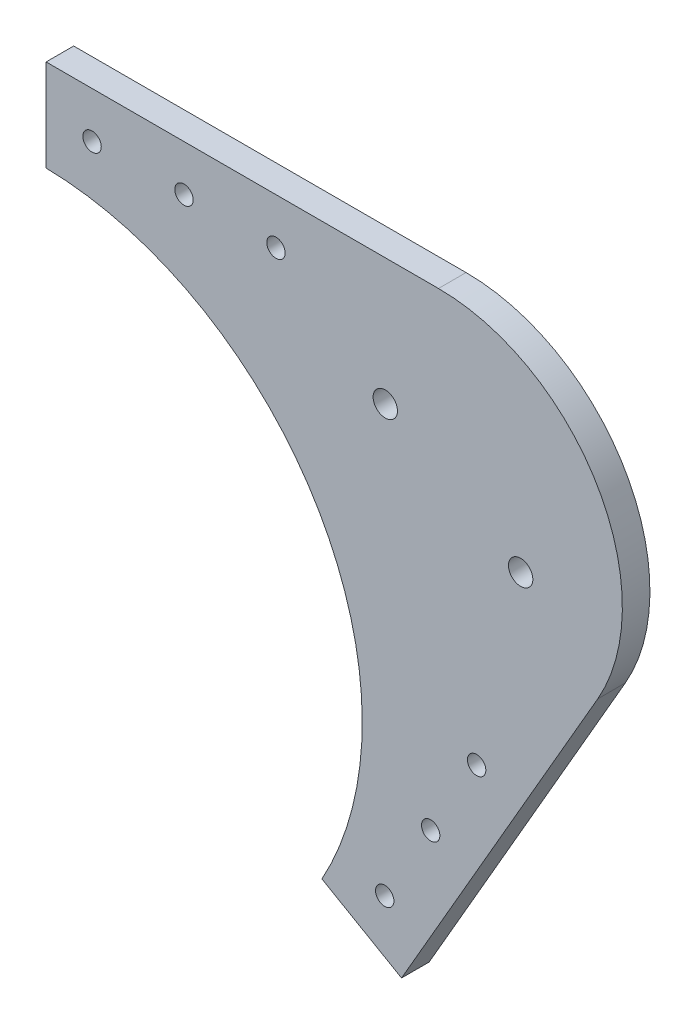
ISO-10303-21;
HEADER;
FILE_DESCRIPTION(('STEP AP214'),'2;1');
FILE_NAME('part.step','',(''),(''),'','','');
FILE_SCHEMA(('AUTOMOTIVE_DESIGN { 1 0 10303 214 1 1 1 1 }'));
ENDSEC;
DATA;
#1=APPLICATION_CONTEXT('core data for automotive mechanical design processes');
#2=APPLICATION_PROTOCOL_DEFINITION('international standard','automotive_design',2000,#1);
#3=PRODUCT_CONTEXT('',#1,'mechanical');
#4=PRODUCT('Part','Part','',(#3));
#5=PRODUCT_RELATED_PRODUCT_CATEGORY('part','',(#4));
#6=PRODUCT_DEFINITION_FORMATION('','',#4);
#7=PRODUCT_DEFINITION_CONTEXT('part definition',#1,'design');
#8=PRODUCT_DEFINITION('design','',#6,#7);
#9=PRODUCT_DEFINITION_SHAPE('','',#8);
#10=(LENGTH_UNIT() NAMED_UNIT(*) SI_UNIT(.MILLI.,.METRE.));
#11=(NAMED_UNIT(*) PLANE_ANGLE_UNIT() SI_UNIT($,.RADIAN.));
#12=(NAMED_UNIT(*) SI_UNIT($,.STERADIAN.) SOLID_ANGLE_UNIT());
#13=UNCERTAINTY_MEASURE_WITH_UNIT(LENGTH_MEASURE(1.E-05),#10,'distance_accuracy_value','');
#14=(GEOMETRIC_REPRESENTATION_CONTEXT(3) GLOBAL_UNCERTAINTY_ASSIGNED_CONTEXT((#13)) GLOBAL_UNIT_ASSIGNED_CONTEXT((#10,
#11,#12)) REPRESENTATION_CONTEXT('',''));
#15=CARTESIAN_POINT('',(0.,0.,0.));
#16=DIRECTION('',(0.,0.,1.));
#17=DIRECTION('',(1.,0.,0.));
#18=AXIS2_PLACEMENT_3D('',#15,#16,#17);
#19=CARTESIAN_POINT('',(0.,0.,6.));
#20=DIRECTION('',(1.,0.,0.));
#21=DIRECTION('',(0.,0.,-1.));
#22=AXIS2_PLACEMENT_3D('',#19,#20,#21);
#23=PLANE('',#22);
#24=DIRECTION('',(0.,-1.,0.));
#25=VECTOR('',#24,1.);
#26=CARTESIAN_POINT('',(0.,0.,0.));
#27=LINE('',#26,#25);
#28=CARTESIAN_POINT('',(0.,20.,0.));
#29=VERTEX_POINT('',#28);
#30=CARTESIAN_POINT('',(0.,0.,0.));
#31=VERTEX_POINT('',#30);
#32=EDGE_CURVE('E120',#29,#31,#27,.T.);
#33=ORIENTED_EDGE('',*,*,#32,.T.);
#34=DIRECTION('',(0.,0.,-1.));
#35=VECTOR('',#34,1.);
#36=CARTESIAN_POINT('',(0.,0.,6.));
#37=LINE('',#36,#35);
#38=CARTESIAN_POINT('',(0.,0.,6.));
#39=VERTEX_POINT('',#38);
#40=EDGE_CURVE('E118',#39,#31,#37,.T.);
#41=ORIENTED_EDGE('',*,*,#40,.F.);
#42=DIRECTION('',(0.,-1.,0.));
#43=VECTOR('',#42,1.);
#44=CARTESIAN_POINT('',(0.,0.,6.));
#45=LINE('',#44,#43);
#46=CARTESIAN_POINT('',(0.,20.,6.));
#47=VERTEX_POINT('',#46);
#48=EDGE_CURVE('E101',#47,#39,#45,.T.);
#49=ORIENTED_EDGE('',*,*,#48,.F.);
#50=DIRECTION('',(0.,0.,-1.));
#51=VECTOR('',#50,1.);
#52=CARTESIAN_POINT('',(0.,20.,6.));
#53=LINE('',#52,#51);
#54=EDGE_CURVE('E260',#47,#29,#53,.T.);
#55=ORIENTED_EDGE('',*,*,#54,.T.);
#56=EDGE_LOOP('',(#33,#41,#49,#55));
#57=FACE_BOUND('',#56,.T.);
#58=ADVANCED_FACE('F46',(#57),#23,.F.);
#59=CARTESIAN_POINT('',(77.3205080756882,-113.923048454132,6.));
#60=DIRECTION('',(0.500000000000004,0.866025403784436,0.));
#61=DIRECTION('',(-0.866025403784436,0.500000000000004,0.));
#62=AXIS2_PLACEMENT_3D('',#59,#60,#61);
#63=PLANE('',#62);
#64=DIRECTION('',(0.866025403784436,-0.500000000000004,0.));
#65=VECTOR('',#64,1.);
#66=CARTESIAN_POINT('',(77.3205080756882,-113.923048454132,0.));
#67=LINE('',#66,#65);
#68=CARTESIAN_POINT('',(59.9999999999995,-103.923048454132,0.));
#69=VERTEX_POINT('',#68);
#70=CARTESIAN_POINT('',(77.3205080756882,-113.923048454132,0.));
#71=VERTEX_POINT('',#70);
#72=EDGE_CURVE('E256',#69,#71,#67,.T.);
#73=ORIENTED_EDGE('',*,*,#72,.T.);
#74=DIRECTION('',(0.,0.,-1.));
#75=VECTOR('',#74,1.);
#76=CARTESIAN_POINT('',(77.3205080756882,-113.923048454132,6.));
#77=LINE('',#76,#75);
#78=CARTESIAN_POINT('',(77.3205080756882,-113.923048454132,6.));
#79=VERTEX_POINT('',#78);
#80=EDGE_CURVE('E263',#79,#71,#77,.T.);
#81=ORIENTED_EDGE('',*,*,#80,.F.);
#82=DIRECTION('',(0.866025403784436,-0.500000000000004,0.));
#83=VECTOR('',#82,1.);
#84=CARTESIAN_POINT('',(77.3205080756882,-113.923048454132,6.));
#85=LINE('',#84,#83);
#86=CARTESIAN_POINT('',(59.9999999999995,-103.923048454132,6.));
#87=VERTEX_POINT('',#86);
#88=EDGE_CURVE('E113',#87,#79,#85,.T.);
#89=ORIENTED_EDGE('',*,*,#88,.F.);
#90=DIRECTION('',(0.,0.,-1.));
#91=VECTOR('',#90,1.);
#92=CARTESIAN_POINT('',(59.9999999999995,-103.923048454132,6.));
#93=LINE('',#92,#91);
#94=EDGE_CURVE('E124',#87,#69,#93,.T.);
#95=ORIENTED_EDGE('',*,*,#94,.T.);
#96=EDGE_LOOP('',(#73,#81,#89,#95));
#97=FACE_BOUND('',#96,.T.);
#98=ADVANCED_FACE('F270',(#97),#63,.F.);
#99=CARTESIAN_POINT('',(154.641016151378,20.,6.));
#100=DIRECTION('',(-0.866025403784436,0.500000000000004,0.));
#101=DIRECTION('',(-0.500000000000004,-0.866025403784436,0.));
#102=AXIS2_PLACEMENT_3D('',#99,#100,#101);
#103=PLANE('',#102);
#104=DIRECTION('',(0.500000000000004,0.866025403784436,0.));
#105=VECTOR('',#104,1.);
#106=CARTESIAN_POINT('',(154.641016151378,20.,0.));
#107=LINE('',#106,#105);
#108=CARTESIAN_POINT('',(120.,-40.0000000000002,0.));
#109=VERTEX_POINT('',#108);
#110=EDGE_CURVE('E253',#71,#109,#107,.T.);
#111=ORIENTED_EDGE('',*,*,#110,.T.);
#112=DIRECTION('',(0.,0.,-1.));
#113=VECTOR('',#112,1.);
#114=CARTESIAN_POINT('',(120.,-40.0000000000002,6.));
#115=LINE('',#114,#113);
#116=CARTESIAN_POINT('',(120.,-40.0000000000002,6.));
#117=VERTEX_POINT('',#116);
#118=EDGE_CURVE('E56',#109,#117,#115,.F.);
#119=ORIENTED_EDGE('',*,*,#118,.T.);
#120=DIRECTION('',(0.500000000000004,0.866025403784436,0.));
#121=VECTOR('',#120,1.);
#122=CARTESIAN_POINT('',(154.641016151378,20.,6.));
#123=LINE('',#122,#121);
#124=EDGE_CURVE('E151',#79,#117,#123,.T.);
#125=ORIENTED_EDGE('',*,*,#124,.F.);
#126=ORIENTED_EDGE('',*,*,#80,.T.);
#127=EDGE_LOOP('',(#111,#119,#125,#126));
#128=FACE_BOUND('',#127,.T.);
#129=ADVANCED_FACE('F299',(#128),#103,.F.);
#130=CARTESIAN_POINT('',(0.,20.,6.));
#131=DIRECTION('',(0.,-1.,0.));
#132=DIRECTION('',(0.,0.,-1.));
#133=AXIS2_PLACEMENT_3D('',#130,#131,#132);
#134=PLANE('',#133);
#135=DIRECTION('',(-1.,0.,0.));
#136=VECTOR('',#135,1.);
#137=CARTESIAN_POINT('',(0.,20.,6.));
#138=LINE('',#137,#136);
#139=CARTESIAN_POINT('',(85.3589838486223,20.,6.));
#140=VERTEX_POINT('',#139);
#141=EDGE_CURVE('E108',#140,#47,#138,.T.);
#142=ORIENTED_EDGE('',*,*,#141,.F.);
#143=DIRECTION('',(0.,0.,-1.));
#144=VECTOR('',#143,1.);
#145=CARTESIAN_POINT('',(85.3589838486223,20.,6.));
#146=LINE('',#145,#144);
#147=CARTESIAN_POINT('',(85.3589838486223,20.,0.));
#148=VERTEX_POINT('',#147);
#149=EDGE_CURVE('E130',#140,#148,#146,.T.);
#150=ORIENTED_EDGE('',*,*,#149,.T.);
#151=DIRECTION('',(-1.,0.,0.));
#152=VECTOR('',#151,1.);
#153=CARTESIAN_POINT('',(0.,20.,0.));
#154=LINE('',#153,#152);
#155=EDGE_CURVE('E114',#148,#29,#154,.T.);
#156=ORIENTED_EDGE('',*,*,#155,.T.);
#157=ORIENTED_EDGE('',*,*,#54,.F.);
#158=EDGE_LOOP('',(#142,#150,#156,#157));
#159=FACE_BOUND('',#158,.T.);
#160=ADVANCED_FACE('F311',(#159),#134,.F.);
#161=CARTESIAN_POINT('',(0.,0.,6.));
#162=DIRECTION('',(0.,0.,-1.));
#163=DIRECTION('',(-1.,0.,0.));
#164=AXIS2_PLACEMENT_3D('',#161,#162,#163);
#165=PLANE('',#164);
#166=CARTESIAN_POINT('',(10.,10.,6.));
#167=DIRECTION('',(0.,0.,1.));
#168=DIRECTION('',(1.,0.,0.));
#169=AXIS2_PLACEMENT_3D('',#166,#167,#168);
#170=CIRCLE('',#169,2.);
#171=CARTESIAN_POINT('',(12.,10.,6.));
#172=VERTEX_POINT('',#171);
#173=EDGE_CURVE('E199',#172,#172,#170,.T.);
#174=ORIENTED_EDGE('',*,*,#173,.F.);
#175=EDGE_LOOP('',(#174));
#176=FACE_BOUND('',#175,.T.);
#177=CARTESIAN_POINT('',(30.,10.,6.));
#178=DIRECTION('',(0.,0.,1.));
#179=DIRECTION('',(1.,0.,0.));
#180=AXIS2_PLACEMENT_3D('',#177,#178,#179);
#181=CIRCLE('',#180,2.);
#182=CARTESIAN_POINT('',(32.,10.,6.));
#183=VERTEX_POINT('',#182);
#184=EDGE_CURVE('E194',#183,#183,#181,.T.);
#185=ORIENTED_EDGE('',*,*,#184,.F.);
#186=EDGE_LOOP('',(#185));
#187=FACE_BOUND('',#186,.T.);
#188=CARTESIAN_POINT('',(50.,10.,6.));
#189=DIRECTION('',(0.,0.,1.));
#190=DIRECTION('',(1.,0.,0.));
#191=AXIS2_PLACEMENT_3D('',#188,#189,#190);
#192=CIRCLE('',#191,2.);
#193=CARTESIAN_POINT('',(52.,10.,6.));
#194=VERTEX_POINT('',#193);
#195=EDGE_CURVE('E189',#194,#194,#192,.T.);
#196=ORIENTED_EDGE('',*,*,#195,.F.);
#197=EDGE_LOOP('',(#196));
#198=FACE_BOUND('',#197,.T.);
#199=CARTESIAN_POINT('',(73.6602540378439,-100.262794416288,6.));
#200=DIRECTION('',(0.,0.,1.));
#201=DIRECTION('',(1.,0.,0.));
#202=AXIS2_PLACEMENT_3D('',#199,#200,#201);
#203=CIRCLE('',#202,2.);
#204=CARTESIAN_POINT('',(75.6602540378439,-100.262794416288,6.));
#205=VERTEX_POINT('',#204);
#206=EDGE_CURVE('E185',#205,#205,#203,.T.);
#207=ORIENTED_EDGE('',*,*,#206,.F.);
#208=EDGE_LOOP('',(#207));
#209=FACE_BOUND('',#208,.T.);
#210=CARTESIAN_POINT('',(83.660254037844,-82.9422863405993,6.));
#211=DIRECTION('',(0.,0.,1.));
#212=DIRECTION('',(1.,0.,0.));
#213=AXIS2_PLACEMENT_3D('',#210,#211,#212);
#214=CIRCLE('',#213,2.);
#215=CARTESIAN_POINT('',(85.660254037844,-82.9422863405993,6.));
#216=VERTEX_POINT('',#215);
#217=EDGE_CURVE('E177',#216,#216,#214,.T.);
#218=ORIENTED_EDGE('',*,*,#217,.F.);
#219=EDGE_LOOP('',(#218));
#220=FACE_BOUND('',#219,.T.);
#221=CARTESIAN_POINT('',(93.660254037844,-65.6217782649105,6.));
#222=DIRECTION('',(0.,0.,1.));
#223=DIRECTION('',(1.,0.,0.));
#224=AXIS2_PLACEMENT_3D('',#221,#222,#223);
#225=CIRCLE('',#224,2.);
#226=CARTESIAN_POINT('',(95.660254037844,-65.6217782649105,6.));
#227=VERTEX_POINT('',#226);
#228=EDGE_CURVE('E172',#227,#227,#225,.T.);
#229=ORIENTED_EDGE('',*,*,#228,.F.);
#230=EDGE_LOOP('',(#229));
#231=FACE_BOUND('',#230,.T.);
#232=CARTESIAN_POINT('',(103.232600297823,-24.5458345764419,6.));
#233=DIRECTION('',(0.,0.,-1.));
#234=DIRECTION('',(-1.,0.,0.));
#235=AXIS2_PLACEMENT_3D('',#232,#233,#234);
#236=CIRCLE('',#235,2.65);
#237=CARTESIAN_POINT('',(100.582600297823,-24.5458345764419,6.));
#238=VERTEX_POINT('',#237);
#239=EDGE_CURVE('E145',#238,#238,#236,.T.);
#240=ORIENTED_EDGE('',*,*,#239,.T.);
#241=EDGE_LOOP('',(#240));
#242=FACE_BOUND('',#241,.T.);
#243=CARTESIAN_POINT('',(73.787736569152,-7.54583457644185,6.));
#244=DIRECTION('',(0.,0.,-1.));
#245=DIRECTION('',(-1.,0.,0.));
#246=AXIS2_PLACEMENT_3D('',#243,#244,#245);
#247=CIRCLE('',#246,2.65);
#248=CARTESIAN_POINT('',(71.137736569152,-7.54583457644185,6.));
#249=VERTEX_POINT('',#248);
#250=EDGE_CURVE('E159',#249,#249,#247,.T.);
#251=ORIENTED_EDGE('',*,*,#250,.T.);
#252=EDGE_LOOP('',(#251));
#253=FACE_BOUND('',#252,.T.);
#254=ORIENTED_EDGE('',*,*,#124,.T.);
#255=CARTESIAN_POINT('',(85.3589838486223,-20.,6.));
#256=DIRECTION('',(0.,0.,-1.));
#257=DIRECTION('',(-1.,0.,0.));
#258=AXIS2_PLACEMENT_3D('',#255,#256,#257);
#259=CIRCLE('',#258,40.);
#260=EDGE_CURVE('E12',#117,#140,#259,.F.);
#261=ORIENTED_EDGE('',*,*,#260,.T.);
#262=ORIENTED_EDGE('',*,*,#141,.T.);
#263=ORIENTED_EDGE('',*,*,#48,.T.);
#264=CARTESIAN_POINT('',(-1.22498999199263,-69.9892806043863,6.));
#265=DIRECTION('',(0.,0.,-1.));
#266=DIRECTION('',(-1.,0.,0.));
#267=AXIS2_PLACEMENT_3D('',#264,#265,#266);
#268=CIRCLE('',#267,70.);
#269=EDGE_CURVE('E105',#39,#87,#268,.T.);
#270=ORIENTED_EDGE('',*,*,#269,.T.);
#271=ORIENTED_EDGE('',*,*,#88,.T.);
#272=EDGE_LOOP('',(#254,#261,#262,#263,#270,#271));
#273=FACE_BOUND('',#272,.T.);
#274=ADVANCED_FACE('F103',(#176,#187,#198,#209,#220,#231,#242,#253,#273),#165,.F.);
#275=CARTESIAN_POINT('',(0.,0.,0.));
#276=DIRECTION('',(0.,0.,-1.));
#277=DIRECTION('',(-1.,0.,0.));
#278=AXIS2_PLACEMENT_3D('',#275,#276,#277);
#279=PLANE('',#278);
#280=CARTESIAN_POINT('',(10.,10.,0.));
#281=DIRECTION('',(0.,0.,-1.));
#282=DIRECTION('',(-1.,0.,0.));
#283=AXIS2_PLACEMENT_3D('',#280,#281,#282);
#284=CIRCLE('',#283,2.);
#285=CARTESIAN_POINT('',(8.,10.,0.));
#286=VERTEX_POINT('',#285);
#287=EDGE_CURVE('E50',#286,#286,#284,.T.);
#288=ORIENTED_EDGE('',*,*,#287,.F.);
#289=EDGE_LOOP('',(#288));
#290=FACE_BOUND('',#289,.T.);
#291=CARTESIAN_POINT('',(30.,10.,0.));
#292=DIRECTION('',(0.,0.,-1.));
#293=DIRECTION('',(-1.,0.,0.));
#294=AXIS2_PLACEMENT_3D('',#291,#292,#293);
#295=CIRCLE('',#294,2.);
#296=CARTESIAN_POINT('',(28.,10.,0.));
#297=VERTEX_POINT('',#296);
#298=EDGE_CURVE('E225',#297,#297,#295,.T.);
#299=ORIENTED_EDGE('',*,*,#298,.F.);
#300=EDGE_LOOP('',(#299));
#301=FACE_BOUND('',#300,.T.);
#302=CARTESIAN_POINT('',(50.,10.,0.));
#303=DIRECTION('',(0.,0.,-1.));
#304=DIRECTION('',(-1.,0.,0.));
#305=AXIS2_PLACEMENT_3D('',#302,#303,#304);
#306=CIRCLE('',#305,2.);
#307=CARTESIAN_POINT('',(48.,10.,0.));
#308=VERTEX_POINT('',#307);
#309=EDGE_CURVE('E222',#308,#308,#306,.T.);
#310=ORIENTED_EDGE('',*,*,#309,.F.);
#311=EDGE_LOOP('',(#310));
#312=FACE_BOUND('',#311,.T.);
#313=CARTESIAN_POINT('',(73.6602540378439,-100.262794416288,0.));
#314=DIRECTION('',(0.,0.,-1.));
#315=DIRECTION('',(-1.,0.,0.));
#316=AXIS2_PLACEMENT_3D('',#313,#314,#315);
#317=CIRCLE('',#316,2.);
#318=CARTESIAN_POINT('',(71.6602540378439,-100.262794416288,0.));
#319=VERTEX_POINT('',#318);
#320=EDGE_CURVE('E215',#319,#319,#317,.T.);
#321=ORIENTED_EDGE('',*,*,#320,.F.);
#322=EDGE_LOOP('',(#321));
#323=FACE_BOUND('',#322,.T.);
#324=CARTESIAN_POINT('',(83.660254037844,-82.9422863405993,0.));
#325=DIRECTION('',(0.,0.,-1.));
#326=DIRECTION('',(-1.,0.,0.));
#327=AXIS2_PLACEMENT_3D('',#324,#325,#326);
#328=CIRCLE('',#327,2.);
#329=CARTESIAN_POINT('',(81.660254037844,-82.9422863405993,0.));
#330=VERTEX_POINT('',#329);
#331=EDGE_CURVE('E209',#330,#330,#328,.T.);
#332=ORIENTED_EDGE('',*,*,#331,.F.);
#333=EDGE_LOOP('',(#332));
#334=FACE_BOUND('',#333,.T.);
#335=CARTESIAN_POINT('',(93.660254037844,-65.6217782649105,0.));
#336=DIRECTION('',(0.,0.,-1.));
#337=DIRECTION('',(-1.,0.,0.));
#338=AXIS2_PLACEMENT_3D('',#335,#336,#337);
#339=CIRCLE('',#338,2.);
#340=CARTESIAN_POINT('',(91.660254037844,-65.6217782649105,0.));
#341=VERTEX_POINT('',#340);
#342=EDGE_CURVE('E204',#341,#341,#339,.T.);
#343=ORIENTED_EDGE('',*,*,#342,.F.);
#344=EDGE_LOOP('',(#343));
#345=FACE_BOUND('',#344,.T.);
#346=CARTESIAN_POINT('',(103.232600297823,-24.5458345764419,0.));
#347=DIRECTION('',(0.,0.,1.));
#348=DIRECTION('',(1.,0.,0.));
#349=AXIS2_PLACEMENT_3D('',#346,#347,#348);
#350=CIRCLE('',#349,2.65);
#351=CARTESIAN_POINT('',(105.882600297823,-24.5458345764419,0.));
#352=VERTEX_POINT('',#351);
#353=EDGE_CURVE('E164',#352,#352,#350,.T.);
#354=ORIENTED_EDGE('',*,*,#353,.T.);
#355=EDGE_LOOP('',(#354));
#356=FACE_BOUND('',#355,.T.);
#357=CARTESIAN_POINT('',(73.787736569152,-7.54583457644185,0.));
#358=DIRECTION('',(0.,0.,1.));
#359=DIRECTION('',(1.,0.,0.));
#360=AXIS2_PLACEMENT_3D('',#357,#358,#359);
#361=CIRCLE('',#360,2.65);
#362=CARTESIAN_POINT('',(76.437736569152,-7.54583457644185,0.));
#363=VERTEX_POINT('',#362);
#364=EDGE_CURVE('E165',#363,#363,#361,.T.);
#365=ORIENTED_EDGE('',*,*,#364,.T.);
#366=EDGE_LOOP('',(#365));
#367=FACE_BOUND('',#366,.T.);
#368=ORIENTED_EDGE('',*,*,#155,.F.);
#369=CARTESIAN_POINT('',(85.3589838486223,-20.,0.));
#370=DIRECTION('',(0.,0.,-1.));
#371=DIRECTION('',(-1.,0.,0.));
#372=AXIS2_PLACEMENT_3D('',#369,#370,#371);
#373=CIRCLE('',#372,40.);
#374=EDGE_CURVE('E71',#148,#109,#373,.T.);
#375=ORIENTED_EDGE('',*,*,#374,.T.);
#376=ORIENTED_EDGE('',*,*,#110,.F.);
#377=ORIENTED_EDGE('',*,*,#72,.F.);
#378=CARTESIAN_POINT('',(-1.22498999199263,-69.9892806043863,0.));
#379=DIRECTION('',(0.,0.,-1.));
#380=DIRECTION('',(-1.,0.,0.));
#381=AXIS2_PLACEMENT_3D('',#378,#379,#380);
#382=CIRCLE('',#381,70.);
#383=EDGE_CURVE('E123',#69,#31,#382,.F.);
#384=ORIENTED_EDGE('',*,*,#383,.T.);
#385=ORIENTED_EDGE('',*,*,#32,.F.);
#386=EDGE_LOOP('',(#368,#375,#376,#377,#384,#385));
#387=FACE_BOUND('',#386,.T.);
#388=ADVANCED_FACE('F236',(#290,#301,#312,#323,#334,#345,#356,#367,#387),#279,.T.);
#389=CARTESIAN_POINT('',(-1.22498999199263,-69.9892806043863,6.));
#390=DIRECTION('',(0.,0.,1.));
#391=DIRECTION('',(1.,0.,0.));
#392=AXIS2_PLACEMENT_3D('',#389,#390,#391);
#393=CYLINDRICAL_SURFACE('',#392,70.);
#394=ORIENTED_EDGE('',*,*,#269,.F.);
#395=ORIENTED_EDGE('',*,*,#40,.T.);
#396=ORIENTED_EDGE('',*,*,#383,.F.);
#397=ORIENTED_EDGE('',*,*,#94,.F.);
#398=EDGE_LOOP('',(#394,#395,#396,#397));
#399=FACE_BOUND('',#398,.T.);
#400=ADVANCED_FACE('F127',(#399),#393,.F.);
#401=CARTESIAN_POINT('',(85.3589838486223,-20.,6.));
#402=DIRECTION('',(0.,0.,-1.));
#403=DIRECTION('',(-1.,0.,0.));
#404=AXIS2_PLACEMENT_3D('',#401,#402,#403);
#405=CYLINDRICAL_SURFACE('',#404,40.);
#406=ORIENTED_EDGE('',*,*,#260,.F.);
#407=ORIENTED_EDGE('',*,*,#118,.F.);
#408=ORIENTED_EDGE('',*,*,#374,.F.);
#409=ORIENTED_EDGE('',*,*,#149,.F.);
#410=EDGE_LOOP('',(#406,#407,#408,#409));
#411=FACE_BOUND('',#410,.T.);
#412=ADVANCED_FACE('F48',(#411),#405,.T.);
#413=CARTESIAN_POINT('',(73.787736569152,-7.54583457644185,0.));
#414=DIRECTION('',(0.,0.,1.));
#415=DIRECTION('',(1.,0.,0.));
#416=AXIS2_PLACEMENT_3D('',#413,#414,#415);
#417=CYLINDRICAL_SURFACE('',#416,2.65);
#418=ORIENTED_EDGE('',*,*,#364,.F.);
#419=EDGE_LOOP('',(#418));
#420=FACE_BOUND('',#419,.T.);
#421=ORIENTED_EDGE('',*,*,#250,.F.);
#422=EDGE_LOOP('',(#421));
#423=FACE_BOUND('',#422,.T.);
#424=ADVANCED_FACE('F283',(#420,#423),#417,.F.);
#425=CARTESIAN_POINT('',(103.232600297823,-24.5458345764419,0.));
#426=DIRECTION('',(0.,0.,1.));
#427=DIRECTION('',(1.,0.,0.));
#428=AXIS2_PLACEMENT_3D('',#425,#426,#427);
#429=CYLINDRICAL_SURFACE('',#428,2.65);
#430=ORIENTED_EDGE('',*,*,#353,.F.);
#431=EDGE_LOOP('',(#430));
#432=FACE_BOUND('',#431,.T.);
#433=ORIENTED_EDGE('',*,*,#239,.F.);
#434=EDGE_LOOP('',(#433));
#435=FACE_BOUND('',#434,.T.);
#436=ADVANCED_FACE('F280',(#432,#435),#429,.F.);
#437=CARTESIAN_POINT('',(93.660254037844,-65.6217782649105,-4.));
#438=DIRECTION('',(0.,0.,1.));
#439=DIRECTION('',(1.,0.,0.));
#440=AXIS2_PLACEMENT_3D('',#437,#438,#439);
#441=CYLINDRICAL_SURFACE('',#440,2.);
#442=ORIENTED_EDGE('',*,*,#342,.T.);
#443=EDGE_LOOP('',(#442));
#444=FACE_BOUND('',#443,.T.);
#445=ORIENTED_EDGE('',*,*,#228,.T.);
#446=EDGE_LOOP('',(#445));
#447=FACE_BOUND('',#446,.T.);
#448=ADVANCED_FACE('F282',(#444,#447),#441,.F.);
#449=CARTESIAN_POINT('',(83.660254037844,-82.9422863405993,-4.));
#450=DIRECTION('',(0.,0.,1.));
#451=DIRECTION('',(1.,0.,0.));
#452=AXIS2_PLACEMENT_3D('',#449,#450,#451);
#453=CYLINDRICAL_SURFACE('',#452,2.);
#454=ORIENTED_EDGE('',*,*,#331,.T.);
#455=EDGE_LOOP('',(#454));
#456=FACE_BOUND('',#455,.T.);
#457=ORIENTED_EDGE('',*,*,#217,.T.);
#458=EDGE_LOOP('',(#457));
#459=FACE_BOUND('',#458,.T.);
#460=ADVANCED_FACE('F290',(#456,#459),#453,.F.);
#461=CARTESIAN_POINT('',(73.6602540378439,-100.262794416288,-4.));
#462=DIRECTION('',(0.,0.,1.));
#463=DIRECTION('',(1.,0.,0.));
#464=AXIS2_PLACEMENT_3D('',#461,#462,#463);
#465=CYLINDRICAL_SURFACE('',#464,2.);
#466=ORIENTED_EDGE('',*,*,#320,.T.);
#467=EDGE_LOOP('',(#466));
#468=FACE_BOUND('',#467,.T.);
#469=ORIENTED_EDGE('',*,*,#206,.T.);
#470=EDGE_LOOP('',(#469));
#471=FACE_BOUND('',#470,.T.);
#472=ADVANCED_FACE('F380',(#468,#471),#465,.F.);
#473=CARTESIAN_POINT('',(50.,10.,-4.));
#474=DIRECTION('',(0.,0.,1.));
#475=DIRECTION('',(1.,0.,0.));
#476=AXIS2_PLACEMENT_3D('',#473,#474,#475);
#477=CYLINDRICAL_SURFACE('',#476,2.);
#478=ORIENTED_EDGE('',*,*,#309,.T.);
#479=EDGE_LOOP('',(#478));
#480=FACE_BOUND('',#479,.T.);
#481=ORIENTED_EDGE('',*,*,#195,.T.);
#482=EDGE_LOOP('',(#481));
#483=FACE_BOUND('',#482,.T.);
#484=ADVANCED_FACE('F391',(#480,#483),#477,.F.);
#485=CARTESIAN_POINT('',(30.,10.,-4.));
#486=DIRECTION('',(0.,0.,1.));
#487=DIRECTION('',(1.,0.,0.));
#488=AXIS2_PLACEMENT_3D('',#485,#486,#487);
#489=CYLINDRICAL_SURFACE('',#488,2.);
#490=ORIENTED_EDGE('',*,*,#298,.T.);
#491=EDGE_LOOP('',(#490));
#492=FACE_BOUND('',#491,.T.);
#493=ORIENTED_EDGE('',*,*,#184,.T.);
#494=EDGE_LOOP('',(#493));
#495=FACE_BOUND('',#494,.T.);
#496=ADVANCED_FACE('F402',(#492,#495),#489,.F.);
#497=CARTESIAN_POINT('',(10.,10.,-4.));
#498=DIRECTION('',(0.,0.,1.));
#499=DIRECTION('',(1.,0.,0.));
#500=AXIS2_PLACEMENT_3D('',#497,#498,#499);
#501=CYLINDRICAL_SURFACE('',#500,2.);
#502=ORIENTED_EDGE('',*,*,#287,.T.);
#503=EDGE_LOOP('',(#502));
#504=FACE_BOUND('',#503,.T.);
#505=ORIENTED_EDGE('',*,*,#173,.T.);
#506=EDGE_LOOP('',(#505));
#507=FACE_BOUND('',#506,.T.);
#508=ADVANCED_FACE('F234',(#504,#507),#501,.F.);
#509=CLOSED_SHELL('',(#58,#98,#129,#160,#274,#388,#400,#412,#424,#436,#448,#460,#472,#484,#496,#508));
#510=MANIFOLD_SOLID_BREP('B2',#509);
#511=ADVANCED_BREP_SHAPE_REPRESENTATION('',(#18,#510),#14);
#512=SHAPE_DEFINITION_REPRESENTATION(#9,#511);
ENDSEC;
END-ISO-10303-21;
